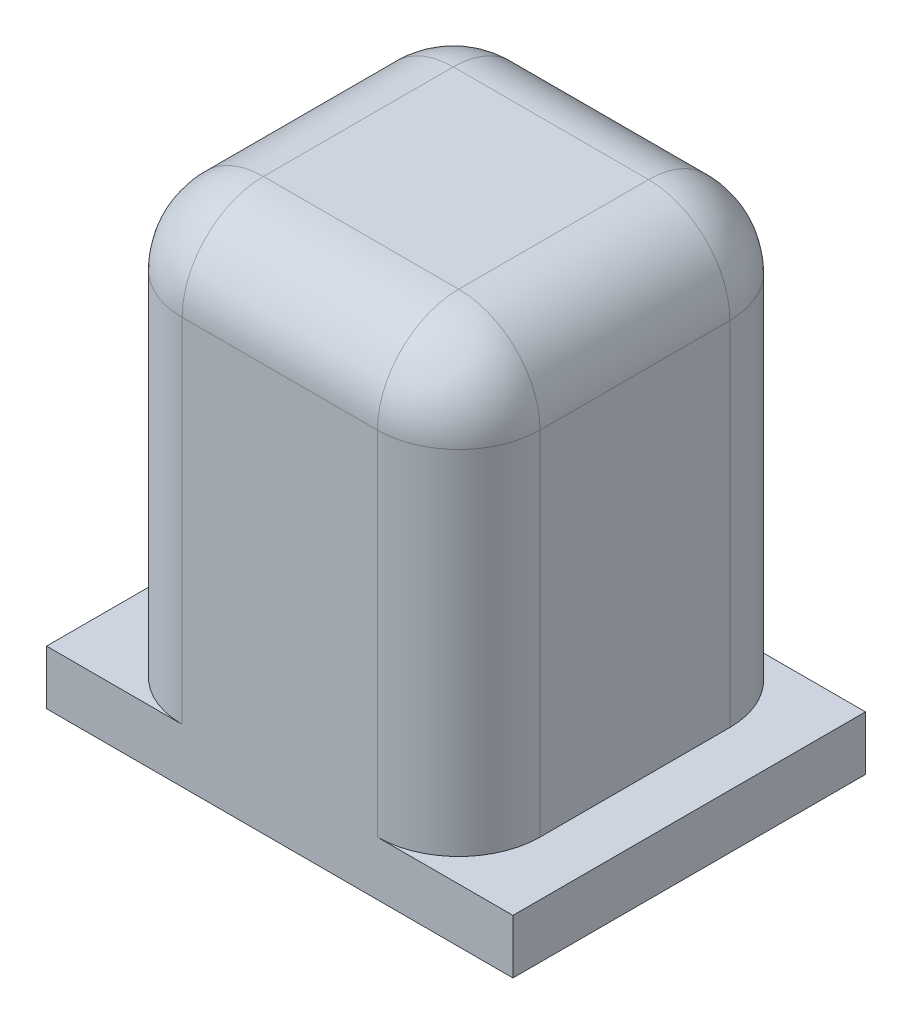
ISO-10303-21;
HEADER;
FILE_DESCRIPTION(('STEP AP214'),'2;1');
FILE_NAME('part.step','',(''),(''),'','','');
FILE_SCHEMA(('AUTOMOTIVE_DESIGN { 1 0 10303 214 1 1 1 1 }'));
ENDSEC;
DATA;
#1=APPLICATION_CONTEXT('core data for automotive mechanical design processes');
#2=APPLICATION_PROTOCOL_DEFINITION('international standard','automotive_design',2000,#1);
#3=PRODUCT_CONTEXT('',#1,'mechanical');
#4=PRODUCT('Part','Part','',(#3));
#5=PRODUCT_RELATED_PRODUCT_CATEGORY('part','',(#4));
#6=PRODUCT_DEFINITION_FORMATION('','',#4);
#7=PRODUCT_DEFINITION_CONTEXT('part definition',#1,'design');
#8=PRODUCT_DEFINITION('design','',#6,#7);
#9=PRODUCT_DEFINITION_SHAPE('','',#8);
#10=(LENGTH_UNIT() NAMED_UNIT(*) SI_UNIT(.MILLI.,.METRE.));
#11=(NAMED_UNIT(*) PLANE_ANGLE_UNIT() SI_UNIT($,.RADIAN.));
#12=(NAMED_UNIT(*) SI_UNIT($,.STERADIAN.) SOLID_ANGLE_UNIT());
#13=UNCERTAINTY_MEASURE_WITH_UNIT(LENGTH_MEASURE(1.E-05),#10,'distance_accuracy_value','');
#14=(GEOMETRIC_REPRESENTATION_CONTEXT(3) GLOBAL_UNCERTAINTY_ASSIGNED_CONTEXT((#13)) GLOBAL_UNIT_ASSIGNED_CONTEXT((#10,
#11,#12)) REPRESENTATION_CONTEXT('',''));
#15=CARTESIAN_POINT('',(0.,0.,0.));
#16=DIRECTION('',(0.,0.,1.));
#17=DIRECTION('',(1.,0.,0.));
#18=AXIS2_PLACEMENT_3D('',#15,#16,#17);
#19=CARTESIAN_POINT('',(0.,47.5,6.5));
#20=DIRECTION('',(0.,-1.,0.));
#21=DIRECTION('',(0.,0.,-1.));
#22=AXIS2_PLACEMENT_3D('',#19,#20,#21);
#23=PLANE('',#22);
#24=DIRECTION('',(-1.,0.,0.));
#25=VECTOR('',#24,1.);
#26=CARTESIAN_POINT('',(0.,47.5,0.));
#27=LINE('',#26,#25);
#28=CARTESIAN_POINT('',(40.0500000000001,47.5,0.));
#29=VERTEX_POINT('',#28);
#30=CARTESIAN_POINT('',(31.45,47.5,0.));
#31=VERTEX_POINT('',#30);
#32=EDGE_CURVE('E142',#29,#31,#27,.T.);
#33=ORIENTED_EDGE('',*,*,#32,.F.);
#34=DIRECTION('',(0.,0.,-1.));
#35=VECTOR('',#34,1.);
#36=CARTESIAN_POINT('',(40.0500000000001,47.5,6.5));
#37=LINE('',#36,#35);
#38=CARTESIAN_POINT('',(40.0500000000001,47.5,6.5));
#39=VERTEX_POINT('',#38);
#40=EDGE_CURVE('E136',#39,#29,#37,.T.);
#41=ORIENTED_EDGE('',*,*,#40,.F.);
#42=DIRECTION('',(-1.,0.,0.));
#43=VECTOR('',#42,1.);
#44=CARTESIAN_POINT('',(0.,47.5,6.5));
#45=LINE('',#44,#43);
#46=CARTESIAN_POINT('',(31.45,47.5,6.5));
#47=VERTEX_POINT('',#46);
#48=EDGE_CURVE('E139',#39,#47,#45,.T.);
#49=ORIENTED_EDGE('',*,*,#48,.T.);
#50=DIRECTION('',(0.,0.,-1.));
#51=VECTOR('',#50,1.);
#52=CARTESIAN_POINT('',(31.45,47.5,6.5));
#53=LINE('',#52,#51);
#54=EDGE_CURVE('E166',#47,#31,#53,.T.);
#55=ORIENTED_EDGE('',*,*,#54,.T.);
#56=EDGE_LOOP('',(#33,#41,#49,#55));
#57=FACE_BOUND('',#56,.T.);
#58=ADVANCED_FACE('F35',(#57),#23,.T.);
#59=CARTESIAN_POINT('',(40.0499999999997,-2.77902700851482E-13,6.5));
#60=DIRECTION('',(-1.,0.,0.));
#61=DIRECTION('',(0.,-1.,0.));
#62=AXIS2_PLACEMENT_3D('',#59,#60,#61);
#63=PLANE('',#62);
#64=DIRECTION('',(0.,1.,0.));
#65=VECTOR('',#64,1.);
#66=CARTESIAN_POINT('',(40.0499999999997,-2.77902700851482E-13,0.));
#67=LINE('',#66,#65);
#68=CARTESIAN_POINT('',(40.0500000000001,48.5,0.));
#69=VERTEX_POINT('',#68);
#70=EDGE_CURVE('E168',#29,#69,#67,.T.);
#71=ORIENTED_EDGE('',*,*,#70,.T.);
#72=DIRECTION('',(0.,0.,-1.));
#73=VECTOR('',#72,1.);
#74=CARTESIAN_POINT('',(40.0500000000001,48.5,6.5));
#75=LINE('',#74,#73);
#76=CARTESIAN_POINT('',(40.0500000000001,48.5,6.5));
#77=VERTEX_POINT('',#76);
#78=EDGE_CURVE('E147',#77,#69,#75,.T.);
#79=ORIENTED_EDGE('',*,*,#78,.F.);
#80=DIRECTION('',(0.,1.,0.));
#81=VECTOR('',#80,1.);
#82=CARTESIAN_POINT('',(40.0499999999997,-2.77902700851482E-13,6.5));
#83=LINE('',#82,#81);
#84=EDGE_CURVE('E150',#39,#77,#83,.T.);
#85=ORIENTED_EDGE('',*,*,#84,.F.);
#86=ORIENTED_EDGE('',*,*,#40,.T.);
#87=EDGE_LOOP('',(#71,#79,#85,#86));
#88=FACE_BOUND('',#87,.T.);
#89=ADVANCED_FACE('F151',(#88),#63,.F.);
#90=CARTESIAN_POINT('',(0.,48.5,6.5));
#91=DIRECTION('',(0.,1.,0.));
#92=DIRECTION('',(0.,0.,1.));
#93=AXIS2_PLACEMENT_3D('',#90,#91,#92);
#94=PLANE('',#93);
#95=DIRECTION('',(1.,0.,0.));
#96=VECTOR('',#95,1.);
#97=CARTESIAN_POINT('',(0.,48.5,0.));
#98=LINE('',#97,#96);
#99=CARTESIAN_POINT('',(37.55,48.5,0.));
#100=VERTEX_POINT('',#99);
#101=EDGE_CURVE('E170',#100,#69,#98,.T.);
#102=ORIENTED_EDGE('',*,*,#101,.F.);
#103=CARTESIAN_POINT('',(37.55,48.5,1.5));
#104=DIRECTION('',(0.,1.,0.));
#105=DIRECTION('',(0.,0.,1.));
#106=AXIS2_PLACEMENT_3D('',#103,#104,#105);
#107=CIRCLE('',#106,1.5);
#108=CARTESIAN_POINT('',(39.05,48.5,1.5));
#109=VERTEX_POINT('',#108);
#110=EDGE_CURVE('E219',#100,#109,#107,.F.);
#111=ORIENTED_EDGE('',*,*,#110,.T.);
#112=DIRECTION('',(0.,0.,-1.));
#113=VECTOR('',#112,1.);
#114=CARTESIAN_POINT('',(39.05,48.5,6.5));
#115=LINE('',#114,#113);
#116=CARTESIAN_POINT('',(39.05,48.5,5.));
#117=VERTEX_POINT('',#116);
#118=EDGE_CURVE('E181',#117,#109,#115,.T.);
#119=ORIENTED_EDGE('',*,*,#118,.F.);
#120=CARTESIAN_POINT('',(37.55,48.5,5.));
#121=DIRECTION('',(0.,1.,0.));
#122=DIRECTION('',(0.,0.,1.));
#123=AXIS2_PLACEMENT_3D('',#120,#121,#122);
#124=CIRCLE('',#123,1.5);
#125=CARTESIAN_POINT('',(37.55,48.5,6.5));
#126=VERTEX_POINT('',#125);
#127=EDGE_CURVE('E44',#117,#126,#124,.F.);
#128=ORIENTED_EDGE('',*,*,#127,.T.);
#129=DIRECTION('',(1.,0.,0.));
#130=VECTOR('',#129,1.);
#131=CARTESIAN_POINT('',(0.,48.5,6.5));
#132=LINE('',#131,#130);
#133=EDGE_CURVE('E52',#126,#77,#132,.T.);
#134=ORIENTED_EDGE('',*,*,#133,.T.);
#135=ORIENTED_EDGE('',*,*,#78,.T.);
#136=EDGE_LOOP('',(#102,#111,#119,#128,#134,#135));
#137=FACE_BOUND('',#136,.T.);
#138=ADVANCED_FACE('F300',(#137),#94,.T.);
#139=CARTESIAN_POINT('',(39.05,0.,6.5));
#140=DIRECTION('',(1.,0.,0.));
#141=DIRECTION('',(0.,0.,-1.));
#142=AXIS2_PLACEMENT_3D('',#139,#140,#141);
#143=PLANE('',#142);
#144=ORIENTED_EDGE('',*,*,#118,.T.);
#145=DIRECTION('',(0.,-1.,0.));
#146=VECTOR('',#145,1.);
#147=CARTESIAN_POINT('',(39.05,56.5,1.5));
#148=LINE('',#147,#146);
#149=CARTESIAN_POINT('',(39.05,55.,1.5));
#150=VERTEX_POINT('',#149);
#151=EDGE_CURVE('E198',#109,#150,#148,.F.);
#152=ORIENTED_EDGE('',*,*,#151,.T.);
#153=DIRECTION('',(0.,0.,-1.));
#154=VECTOR('',#153,1.);
#155=CARTESIAN_POINT('',(39.05,55.,6.5));
#156=LINE('',#155,#154);
#157=CARTESIAN_POINT('',(39.05,55.,5.));
#158=VERTEX_POINT('',#157);
#159=EDGE_CURVE('E195',#150,#158,#156,.F.);
#160=ORIENTED_EDGE('',*,*,#159,.T.);
#161=DIRECTION('',(0.,-1.,0.));
#162=VECTOR('',#161,1.);
#163=CARTESIAN_POINT('',(39.05,0.,5.));
#164=LINE('',#163,#162);
#165=EDGE_CURVE('E193',#158,#117,#164,.T.);
#166=ORIENTED_EDGE('',*,*,#165,.T.);
#167=EDGE_LOOP('',(#144,#152,#160,#166));
#168=FACE_BOUND('',#167,.T.);
#169=ADVANCED_FACE('F466',(#168),#143,.T.);
#170=CARTESIAN_POINT('',(0.,56.5,6.5));
#171=DIRECTION('',(0.,1.,0.));
#172=DIRECTION('',(0.,0.,1.));
#173=AXIS2_PLACEMENT_3D('',#170,#171,#172);
#174=PLANE('',#173);
#175=DIRECTION('',(0.,0.,-1.));
#176=VECTOR('',#175,1.);
#177=CARTESIAN_POINT('',(37.55,56.5,6.5));
#178=LINE('',#177,#176);
#179=CARTESIAN_POINT('',(37.55,56.5,5.));
#180=VERTEX_POINT('',#179);
#181=CARTESIAN_POINT('',(37.55,56.5,1.5));
#182=VERTEX_POINT('',#181);
#183=EDGE_CURVE('E188',#180,#182,#178,.T.);
#184=ORIENTED_EDGE('',*,*,#183,.T.);
#185=DIRECTION('',(1.,0.,0.));
#186=VECTOR('',#185,1.);
#187=CARTESIAN_POINT('',(32.45,56.5,1.5));
#188=LINE('',#187,#186);
#189=CARTESIAN_POINT('',(33.95,56.5,1.5));
#190=VERTEX_POINT('',#189);
#191=EDGE_CURVE('E191',#182,#190,#188,.F.);
#192=ORIENTED_EDGE('',*,*,#191,.T.);
#193=DIRECTION('',(0.,0.,-1.));
#194=VECTOR('',#193,1.);
#195=CARTESIAN_POINT('',(33.95,56.5,6.5));
#196=LINE('',#195,#194);
#197=CARTESIAN_POINT('',(33.95,56.5,5.));
#198=VERTEX_POINT('',#197);
#199=EDGE_CURVE('E186',#190,#198,#196,.F.);
#200=ORIENTED_EDGE('',*,*,#199,.T.);
#201=DIRECTION('',(1.,0.,0.));
#202=VECTOR('',#201,1.);
#203=CARTESIAN_POINT('',(0.,56.5,5.));
#204=LINE('',#203,#202);
#205=EDGE_CURVE('E146',#198,#180,#204,.T.);
#206=ORIENTED_EDGE('',*,*,#205,.T.);
#207=EDGE_LOOP('',(#184,#192,#200,#206));
#208=FACE_BOUND('',#207,.T.);
#209=ADVANCED_FACE('F270',(#208),#174,.T.);
#210=CARTESIAN_POINT('',(32.45,0.,6.5));
#211=DIRECTION('',(1.,0.,0.));
#212=DIRECTION('',(0.,0.,-1.));
#213=AXIS2_PLACEMENT_3D('',#210,#211,#212);
#214=PLANE('',#213);
#215=DIRECTION('',(0.,0.,-1.));
#216=VECTOR('',#215,1.);
#217=CARTESIAN_POINT('',(32.45,55.,0.));
#218=LINE('',#217,#216);
#219=CARTESIAN_POINT('',(32.45,55.,5.));
#220=VERTEX_POINT('',#219);
#221=CARTESIAN_POINT('',(32.45,55.,1.5));
#222=VERTEX_POINT('',#221);
#223=EDGE_CURVE('E202',#220,#222,#218,.T.);
#224=ORIENTED_EDGE('',*,*,#223,.T.);
#225=DIRECTION('',(0.,-1.,0.));
#226=VECTOR('',#225,1.);
#227=CARTESIAN_POINT('',(32.45,0.,1.5));
#228=LINE('',#227,#226);
#229=CARTESIAN_POINT('',(32.45,48.5,1.5));
#230=VERTEX_POINT('',#229);
#231=EDGE_CURVE('E204',#222,#230,#228,.T.);
#232=ORIENTED_EDGE('',*,*,#231,.T.);
#233=DIRECTION('',(0.,0.,-1.));
#234=VECTOR('',#233,1.);
#235=CARTESIAN_POINT('',(32.45,48.5,6.5));
#236=LINE('',#235,#234);
#237=CARTESIAN_POINT('',(32.45,48.5,5.));
#238=VERTEX_POINT('',#237);
#239=EDGE_CURVE('E178',#238,#230,#236,.T.);
#240=ORIENTED_EDGE('',*,*,#239,.F.);
#241=DIRECTION('',(0.,-1.,0.));
#242=VECTOR('',#241,1.);
#243=CARTESIAN_POINT('',(32.45,56.5,5.));
#244=LINE('',#243,#242);
#245=EDGE_CURVE('E200',#238,#220,#244,.F.);
#246=ORIENTED_EDGE('',*,*,#245,.T.);
#247=EDGE_LOOP('',(#224,#232,#240,#246));
#248=FACE_BOUND('',#247,.T.);
#249=ADVANCED_FACE('F280',(#248),#214,.F.);
#250=CARTESIAN_POINT('',(0.,48.5,6.5));
#251=DIRECTION('',(0.,-1.,0.));
#252=DIRECTION('',(0.,0.,-1.));
#253=AXIS2_PLACEMENT_3D('',#250,#251,#252);
#254=PLANE('',#253);
#255=DIRECTION('',(-1.,0.,0.));
#256=VECTOR('',#255,1.);
#257=CARTESIAN_POINT('',(0.,48.5,0.));
#258=LINE('',#257,#256);
#259=CARTESIAN_POINT('',(33.95,48.5,0.));
#260=VERTEX_POINT('',#259);
#261=CARTESIAN_POINT('',(31.45,48.5,0.));
#262=VERTEX_POINT('',#261);
#263=EDGE_CURVE('E159',#260,#262,#258,.T.);
#264=ORIENTED_EDGE('',*,*,#263,.T.);
#265=DIRECTION('',(0.,0.,-1.));
#266=VECTOR('',#265,1.);
#267=CARTESIAN_POINT('',(31.45,48.5,6.5));
#268=LINE('',#267,#266);
#269=CARTESIAN_POINT('',(31.45,48.5,6.5));
#270=VERTEX_POINT('',#269);
#271=EDGE_CURVE('E176',#270,#262,#268,.T.);
#272=ORIENTED_EDGE('',*,*,#271,.F.);
#273=DIRECTION('',(-1.,0.,0.));
#274=VECTOR('',#273,1.);
#275=CARTESIAN_POINT('',(0.,48.5,6.5));
#276=LINE('',#275,#274);
#277=CARTESIAN_POINT('',(33.95,48.5,6.5));
#278=VERTEX_POINT('',#277);
#279=EDGE_CURVE('E163',#278,#270,#276,.T.);
#280=ORIENTED_EDGE('',*,*,#279,.F.);
#281=CARTESIAN_POINT('',(33.95,48.5,5.));
#282=DIRECTION('',(0.,-1.,0.));
#283=DIRECTION('',(0.,0.,-1.));
#284=AXIS2_PLACEMENT_3D('',#281,#282,#283);
#285=CIRCLE('',#284,1.5);
#286=EDGE_CURVE('E11',#278,#238,#285,.T.);
#287=ORIENTED_EDGE('',*,*,#286,.T.);
#288=ORIENTED_EDGE('',*,*,#239,.T.);
#289=CARTESIAN_POINT('',(33.95,48.5,1.5));
#290=DIRECTION('',(0.,-1.,0.));
#291=DIRECTION('',(0.,0.,-1.));
#292=AXIS2_PLACEMENT_3D('',#289,#290,#291);
#293=CIRCLE('',#292,1.5);
#294=EDGE_CURVE('E221',#230,#260,#293,.T.);
#295=ORIENTED_EDGE('',*,*,#294,.T.);
#296=EDGE_LOOP('',(#264,#272,#280,#287,#288,#295));
#297=FACE_BOUND('',#296,.T.);
#298=ADVANCED_FACE('F289',(#297),#254,.F.);
#299=CARTESIAN_POINT('',(31.4500000000004,2.18228213277885E-13,6.5));
#300=DIRECTION('',(-1.,0.,0.));
#301=DIRECTION('',(0.,-1.,0.));
#302=AXIS2_PLACEMENT_3D('',#299,#300,#301);
#303=PLANE('',#302);
#304=DIRECTION('',(0.,1.,0.));
#305=VECTOR('',#304,1.);
#306=CARTESIAN_POINT('',(31.4500000000004,2.18228213277885E-13,0.));
#307=LINE('',#306,#305);
#308=EDGE_CURVE('E156',#31,#262,#307,.T.);
#309=ORIENTED_EDGE('',*,*,#308,.F.);
#310=ORIENTED_EDGE('',*,*,#54,.F.);
#311=DIRECTION('',(0.,1.,0.));
#312=VECTOR('',#311,1.);
#313=CARTESIAN_POINT('',(31.4500000000004,2.18228213277885E-13,6.5));
#314=LINE('',#313,#312);
#315=EDGE_CURVE('E155',#47,#270,#314,.T.);
#316=ORIENTED_EDGE('',*,*,#315,.T.);
#317=ORIENTED_EDGE('',*,*,#271,.T.);
#318=EDGE_LOOP('',(#309,#310,#316,#317));
#319=FACE_BOUND('',#318,.T.);
#320=ADVANCED_FACE('F294',(#319),#303,.T.);
#321=CARTESIAN_POINT('',(0.,0.,6.5));
#322=DIRECTION('',(0.,0.,1.));
#323=DIRECTION('',(1.,0.,0.));
#324=AXIS2_PLACEMENT_3D('',#321,#322,#323);
#325=PLANE('',#324);
#326=ORIENTED_EDGE('',*,*,#133,.F.);
#327=DIRECTION('',(0.,-1.,0.));
#328=VECTOR('',#327,1.);
#329=CARTESIAN_POINT('',(37.55,0.,6.5));
#330=LINE('',#329,#328);
#331=CARTESIAN_POINT('',(37.55,55.,6.5));
#332=VERTEX_POINT('',#331);
#333=EDGE_CURVE('E57',#126,#332,#330,.F.);
#334=ORIENTED_EDGE('',*,*,#333,.T.);
#335=DIRECTION('',(1.,0.,0.));
#336=VECTOR('',#335,1.);
#337=CARTESIAN_POINT('',(0.,55.,6.5));
#338=LINE('',#337,#336);
#339=CARTESIAN_POINT('',(33.95,55.,6.5));
#340=VERTEX_POINT('',#339);
#341=EDGE_CURVE('E216',#332,#340,#338,.F.);
#342=ORIENTED_EDGE('',*,*,#341,.T.);
#343=DIRECTION('',(0.,-1.,0.));
#344=VECTOR('',#343,1.);
#345=CARTESIAN_POINT('',(33.95,48.5,6.5));
#346=LINE('',#345,#344);
#347=EDGE_CURVE('E213',#340,#278,#346,.T.);
#348=ORIENTED_EDGE('',*,*,#347,.T.);
#349=ORIENTED_EDGE('',*,*,#279,.T.);
#350=ORIENTED_EDGE('',*,*,#315,.F.);
#351=ORIENTED_EDGE('',*,*,#48,.F.);
#352=ORIENTED_EDGE('',*,*,#84,.T.);
#353=EDGE_LOOP('',(#326,#334,#342,#348,#349,#350,#351,#352));
#354=FACE_BOUND('',#353,.T.);
#355=ADVANCED_FACE('F153',(#354),#325,.T.);
#356=CARTESIAN_POINT('',(0.,0.,0.));
#357=DIRECTION('',(0.,0.,1.));
#358=DIRECTION('',(1.,0.,0.));
#359=AXIS2_PLACEMENT_3D('',#356,#357,#358);
#360=PLANE('',#359);
#361=DIRECTION('',(0.,-1.,0.));
#362=VECTOR('',#361,1.);
#363=CARTESIAN_POINT('',(37.55,48.5,0.));
#364=LINE('',#363,#362);
#365=CARTESIAN_POINT('',(37.55,55.,0.));
#366=VERTEX_POINT('',#365);
#367=EDGE_CURVE('E210',#366,#100,#364,.T.);
#368=ORIENTED_EDGE('',*,*,#367,.T.);
#369=ORIENTED_EDGE('',*,*,#101,.T.);
#370=ORIENTED_EDGE('',*,*,#70,.F.);
#371=ORIENTED_EDGE('',*,*,#32,.T.);
#372=ORIENTED_EDGE('',*,*,#308,.T.);
#373=ORIENTED_EDGE('',*,*,#263,.F.);
#374=DIRECTION('',(0.,-1.,0.));
#375=VECTOR('',#374,1.);
#376=CARTESIAN_POINT('',(33.95,0.,0.));
#377=LINE('',#376,#375);
#378=CARTESIAN_POINT('',(33.95,55.,0.));
#379=VERTEX_POINT('',#378);
#380=EDGE_CURVE('E206',#260,#379,#377,.F.);
#381=ORIENTED_EDGE('',*,*,#380,.T.);
#382=DIRECTION('',(1.,0.,0.));
#383=VECTOR('',#382,1.);
#384=CARTESIAN_POINT('',(39.05,55.,0.));
#385=LINE('',#384,#383);
#386=EDGE_CURVE('E208',#379,#366,#385,.T.);
#387=ORIENTED_EDGE('',*,*,#386,.T.);
#388=EDGE_LOOP('',(#368,#369,#370,#371,#372,#373,#381,#387));
#389=FACE_BOUND('',#388,.T.);
#390=ADVANCED_FACE('F296',(#389),#360,.F.);
#391=CARTESIAN_POINT('',(33.95,0.,5.));
#392=DIRECTION('',(0.,1.,0.));
#393=DIRECTION('',(0.,0.,1.));
#394=AXIS2_PLACEMENT_3D('',#391,#392,#393);
#395=CYLINDRICAL_SURFACE('',#394,1.5);
#396=ORIENTED_EDGE('',*,*,#286,.F.);
#397=ORIENTED_EDGE('',*,*,#347,.F.);
#398=CARTESIAN_POINT('',(33.95,55.,5.));
#399=DIRECTION('',(0.,1.,0.));
#400=DIRECTION('',(0.,0.,1.));
#401=AXIS2_PLACEMENT_3D('',#398,#399,#400);
#402=CIRCLE('',#401,1.5);
#403=EDGE_CURVE('E39',#220,#340,#402,.T.);
#404=ORIENTED_EDGE('',*,*,#403,.F.);
#405=ORIENTED_EDGE('',*,*,#245,.F.);
#406=EDGE_LOOP('',(#396,#397,#404,#405));
#407=FACE_BOUND('',#406,.T.);
#408=ADVANCED_FACE('F37',(#407),#395,.T.);
#409=CARTESIAN_POINT('',(33.95,55.,6.5));
#410=DIRECTION('',(0.,0.,1.));
#411=DIRECTION('',(1.,0.,0.));
#412=AXIS2_PLACEMENT_3D('',#409,#410,#411);
#413=CYLINDRICAL_SURFACE('',#412,1.5);
#414=CARTESIAN_POINT('',(33.95,55.,1.5));
#415=DIRECTION('',(0.,0.,-1.));
#416=DIRECTION('',(0.,1.,0.));
#417=AXIS2_PLACEMENT_3D('',#414,#415,#416);
#418=CIRCLE('',#417,1.5);
#419=EDGE_CURVE('E250',#222,#190,#418,.T.);
#420=ORIENTED_EDGE('',*,*,#419,.F.);
#421=ORIENTED_EDGE('',*,*,#223,.F.);
#422=CARTESIAN_POINT('',(33.95,55.,5.));
#423=DIRECTION('',(0.,0.,1.));
#424=DIRECTION('',(1.,0.,0.));
#425=AXIS2_PLACEMENT_3D('',#422,#423,#424);
#426=CIRCLE('',#425,1.5);
#427=EDGE_CURVE('E252',#198,#220,#426,.T.);
#428=ORIENTED_EDGE('',*,*,#427,.F.);
#429=ORIENTED_EDGE('',*,*,#199,.F.);
#430=EDGE_LOOP('',(#420,#421,#428,#429));
#431=FACE_BOUND('',#430,.T.);
#432=ADVANCED_FACE('F277',(#431),#413,.T.);
#433=CARTESIAN_POINT('',(33.95,0.,1.5));
#434=DIRECTION('',(0.,-1.,0.));
#435=DIRECTION('',(0.,0.,-1.));
#436=AXIS2_PLACEMENT_3D('',#433,#434,#435);
#437=CYLINDRICAL_SURFACE('',#436,1.5);
#438=ORIENTED_EDGE('',*,*,#294,.F.);
#439=ORIENTED_EDGE('',*,*,#231,.F.);
#440=CARTESIAN_POINT('',(33.95,55.,1.5));
#441=DIRECTION('',(0.,1.,0.));
#442=DIRECTION('',(0.,0.,1.));
#443=AXIS2_PLACEMENT_3D('',#440,#441,#442);
#444=CIRCLE('',#443,1.5);
#445=EDGE_CURVE('E247',#379,#222,#444,.T.);
#446=ORIENTED_EDGE('',*,*,#445,.F.);
#447=ORIENTED_EDGE('',*,*,#380,.F.);
#448=EDGE_LOOP('',(#438,#439,#446,#447));
#449=FACE_BOUND('',#448,.T.);
#450=ADVANCED_FACE('F285',(#449),#437,.T.);
#451=CARTESIAN_POINT('',(33.95,55.,5.));
#452=DIRECTION('',(-1.,0.,0.));
#453=DIRECTION('',(0.,0.,1.));
#454=AXIS2_PLACEMENT_3D('',#451,#452,#453);
#455=SPHERICAL_SURFACE('',#454,1.5);
#456=ORIENTED_EDGE('',*,*,#427,.T.);
#457=ORIENTED_EDGE('',*,*,#403,.T.);
#458=CARTESIAN_POINT('',(33.95,55.,5.));
#459=DIRECTION('',(-1.,0.,0.));
#460=DIRECTION('',(0.,0.,1.));
#461=AXIS2_PLACEMENT_3D('',#458,#459,#460);
#462=CIRCLE('',#461,1.5);
#463=EDGE_CURVE('E244',#198,#340,#462,.F.);
#464=ORIENTED_EDGE('',*,*,#463,.F.);
#465=EDGE_LOOP('',(#456,#457,#464));
#466=FACE_BOUND('',#465,.T.);
#467=ADVANCED_FACE('F259',(#466),#455,.T.);
#468=CARTESIAN_POINT('',(33.95,55.,1.5));
#469=DIRECTION('',(-1.,0.,0.));
#470=DIRECTION('',(0.,0.,1.));
#471=AXIS2_PLACEMENT_3D('',#468,#469,#470);
#472=SPHERICAL_SURFACE('',#471,1.5);
#473=ORIENTED_EDGE('',*,*,#445,.T.);
#474=ORIENTED_EDGE('',*,*,#419,.T.);
#475=CARTESIAN_POINT('',(33.95,55.,1.5));
#476=DIRECTION('',(-1.,0.,0.));
#477=DIRECTION('',(0.,0.,1.));
#478=AXIS2_PLACEMENT_3D('',#475,#476,#477);
#479=CIRCLE('',#478,1.5);
#480=EDGE_CURVE('E241',#379,#190,#479,.F.);
#481=ORIENTED_EDGE('',*,*,#480,.F.);
#482=EDGE_LOOP('',(#473,#474,#481));
#483=FACE_BOUND('',#482,.T.);
#484=ADVANCED_FACE('F320',(#483),#472,.T.);
#485=CARTESIAN_POINT('',(37.55,0.,5.));
#486=DIRECTION('',(0.,-1.,0.));
#487=DIRECTION('',(0.,0.,-1.));
#488=AXIS2_PLACEMENT_3D('',#485,#486,#487);
#489=CYLINDRICAL_SURFACE('',#488,1.5);
#490=ORIENTED_EDGE('',*,*,#127,.F.);
#491=ORIENTED_EDGE('',*,*,#165,.F.);
#492=CARTESIAN_POINT('',(37.55,55.,5.));
#493=DIRECTION('',(0.,1.,0.));
#494=DIRECTION('',(0.,0.,1.));
#495=AXIS2_PLACEMENT_3D('',#492,#493,#494);
#496=CIRCLE('',#495,1.5);
#497=EDGE_CURVE('E238',#332,#158,#496,.T.);
#498=ORIENTED_EDGE('',*,*,#497,.F.);
#499=ORIENTED_EDGE('',*,*,#333,.F.);
#500=EDGE_LOOP('',(#490,#491,#498,#499));
#501=FACE_BOUND('',#500,.T.);
#502=ADVANCED_FACE('F305',(#501),#489,.T.);
#503=CARTESIAN_POINT('',(0.,55.,5.));
#504=DIRECTION('',(1.,0.,0.));
#505=DIRECTION('',(0.,0.,-1.));
#506=AXIS2_PLACEMENT_3D('',#503,#504,#505);
#507=CYLINDRICAL_SURFACE('',#506,1.5);
#508=ORIENTED_EDGE('',*,*,#463,.T.);
#509=ORIENTED_EDGE('',*,*,#341,.F.);
#510=CARTESIAN_POINT('',(37.55,55.,5.));
#511=DIRECTION('',(1.,0.,0.));
#512=DIRECTION('',(0.,0.,-1.));
#513=AXIS2_PLACEMENT_3D('',#510,#511,#512);
#514=CIRCLE('',#513,1.5);
#515=EDGE_CURVE('E235',#180,#332,#514,.T.);
#516=ORIENTED_EDGE('',*,*,#515,.F.);
#517=ORIENTED_EDGE('',*,*,#205,.F.);
#518=EDGE_LOOP('',(#508,#509,#516,#517));
#519=FACE_BOUND('',#518,.T.);
#520=ADVANCED_FACE('F265',(#519),#507,.T.);
#521=CARTESIAN_POINT('',(0.,55.,1.5));
#522=DIRECTION('',(-1.,0.,0.));
#523=DIRECTION('',(0.,0.,1.));
#524=AXIS2_PLACEMENT_3D('',#521,#522,#523);
#525=CYLINDRICAL_SURFACE('',#524,1.5);
#526=ORIENTED_EDGE('',*,*,#480,.T.);
#527=ORIENTED_EDGE('',*,*,#191,.F.);
#528=CARTESIAN_POINT('',(37.55,55.,1.5));
#529=DIRECTION('',(1.,0.,0.));
#530=DIRECTION('',(0.,1.,0.));
#531=AXIS2_PLACEMENT_3D('',#528,#529,#530);
#532=CIRCLE('',#531,1.5);
#533=EDGE_CURVE('E232',#366,#182,#532,.T.);
#534=ORIENTED_EDGE('',*,*,#533,.F.);
#535=ORIENTED_EDGE('',*,*,#386,.F.);
#536=EDGE_LOOP('',(#526,#527,#534,#535));
#537=FACE_BOUND('',#536,.T.);
#538=ADVANCED_FACE('F318',(#537),#525,.T.);
#539=CARTESIAN_POINT('',(37.55,0.,1.5));
#540=DIRECTION('',(0.,1.,0.));
#541=DIRECTION('',(0.,0.,1.));
#542=AXIS2_PLACEMENT_3D('',#539,#540,#541);
#543=CYLINDRICAL_SURFACE('',#542,1.5);
#544=ORIENTED_EDGE('',*,*,#110,.F.);
#545=ORIENTED_EDGE('',*,*,#367,.F.);
#546=CARTESIAN_POINT('',(37.55,55.,1.5));
#547=DIRECTION('',(0.,1.,0.));
#548=DIRECTION('',(0.,0.,1.));
#549=AXIS2_PLACEMENT_3D('',#546,#547,#548);
#550=CIRCLE('',#549,1.5);
#551=EDGE_CURVE('E229',#150,#366,#550,.T.);
#552=ORIENTED_EDGE('',*,*,#551,.F.);
#553=ORIENTED_EDGE('',*,*,#151,.F.);
#554=EDGE_LOOP('',(#544,#545,#552,#553));
#555=FACE_BOUND('',#554,.T.);
#556=ADVANCED_FACE('F343',(#555),#543,.T.);
#557=CARTESIAN_POINT('',(37.55,55.,5.));
#558=DIRECTION('',(0.,0.,1.));
#559=DIRECTION('',(1.,0.,0.));
#560=AXIS2_PLACEMENT_3D('',#557,#558,#559);
#561=SPHERICAL_SURFACE('',#560,1.5);
#562=ORIENTED_EDGE('',*,*,#515,.T.);
#563=ORIENTED_EDGE('',*,*,#497,.T.);
#564=CARTESIAN_POINT('',(37.55,55.,5.));
#565=DIRECTION('',(0.,0.,1.));
#566=DIRECTION('',(1.,0.,0.));
#567=AXIS2_PLACEMENT_3D('',#564,#565,#566);
#568=CIRCLE('',#567,1.5);
#569=EDGE_CURVE('E227',#180,#158,#568,.F.);
#570=ORIENTED_EDGE('',*,*,#569,.F.);
#571=EDGE_LOOP('',(#562,#563,#570));
#572=FACE_BOUND('',#571,.T.);
#573=ADVANCED_FACE('F307',(#572),#561,.T.);
#574=CARTESIAN_POINT('',(37.55,55.,1.5));
#575=DIRECTION('',(0.,0.,-1.));
#576=DIRECTION('',(-1.,0.,0.));
#577=AXIS2_PLACEMENT_3D('',#574,#575,#576);
#578=SPHERICAL_SURFACE('',#577,1.5);
#579=ORIENTED_EDGE('',*,*,#551,.T.);
#580=ORIENTED_EDGE('',*,*,#533,.T.);
#581=CARTESIAN_POINT('',(37.55,55.,1.5));
#582=DIRECTION('',(0.,0.,-1.));
#583=DIRECTION('',(-1.,0.,0.));
#584=AXIS2_PLACEMENT_3D('',#581,#582,#583);
#585=CIRCLE('',#584,1.5);
#586=EDGE_CURVE('E225',#150,#182,#585,.F.);
#587=ORIENTED_EDGE('',*,*,#586,.F.);
#588=EDGE_LOOP('',(#579,#580,#587));
#589=FACE_BOUND('',#588,.T.);
#590=ADVANCED_FACE('F314',(#589),#578,.T.);
#591=CARTESIAN_POINT('',(37.55,55.,6.5));
#592=DIRECTION('',(0.,0.,-1.));
#593=DIRECTION('',(-1.,0.,0.));
#594=AXIS2_PLACEMENT_3D('',#591,#592,#593);
#595=CYLINDRICAL_SURFACE('',#594,1.5);
#596=ORIENTED_EDGE('',*,*,#569,.T.);
#597=ORIENTED_EDGE('',*,*,#159,.F.);
#598=ORIENTED_EDGE('',*,*,#586,.T.);
#599=ORIENTED_EDGE('',*,*,#183,.F.);
#600=EDGE_LOOP('',(#596,#597,#598,#599));
#601=FACE_BOUND('',#600,.T.);
#602=ADVANCED_FACE('F310',(#601),#595,.T.);
#603=CLOSED_SHELL('',(#58,#89,#138,#169,#209,#249,#298,#320,#355,#390,#408,#432,#450,#467,#484,
#502,#520,#538,#556,#573,#590,#602));
#604=MANIFOLD_SOLID_BREP('B2',#603);
#605=ADVANCED_BREP_SHAPE_REPRESENTATION('',(#18,#604),#14);
#606=SHAPE_DEFINITION_REPRESENTATION(#9,#605);
ENDSEC;
END-ISO-10303-21;
